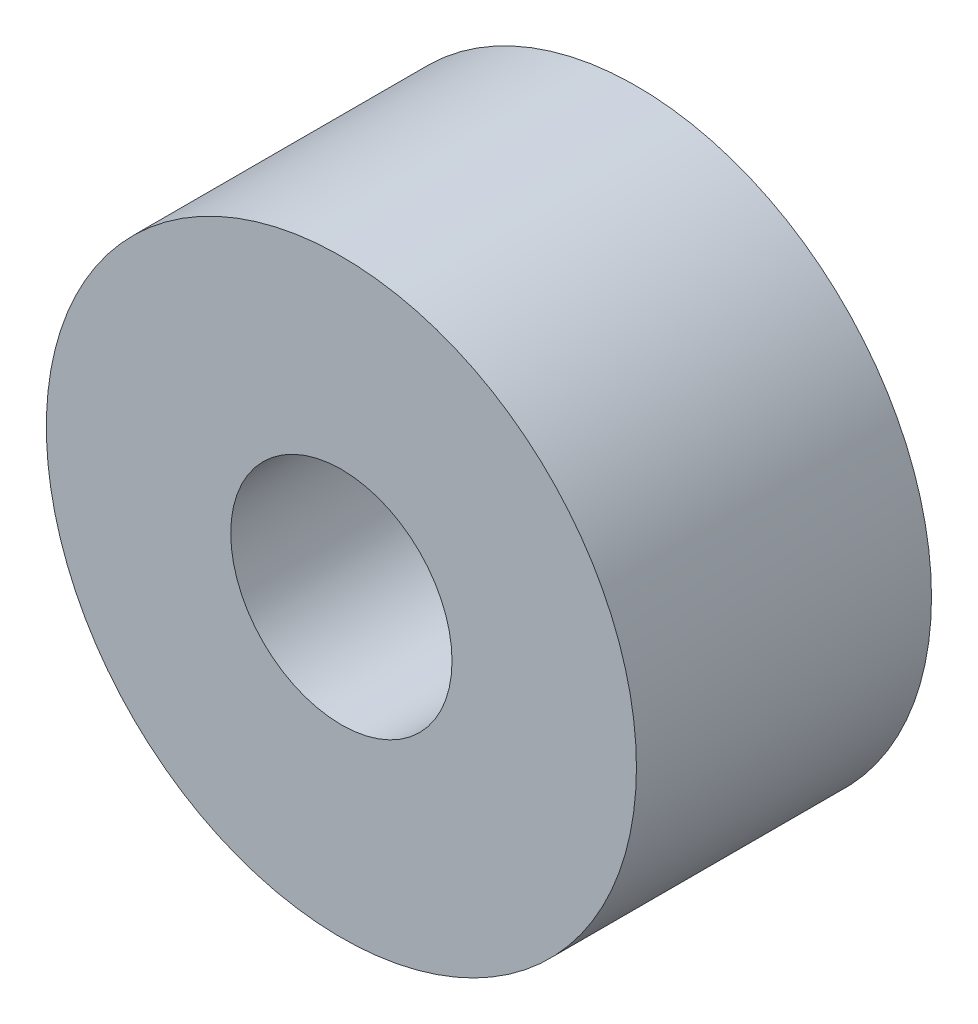
ISO-10303-21;
HEADER;
FILE_DESCRIPTION(('STEP AP214'),'2;1');
FILE_NAME('part.step','',(''),(''),'','','');
FILE_SCHEMA(('AUTOMOTIVE_DESIGN { 1 0 10303 214 1 1 1 1 }'));
ENDSEC;
DATA;
#1=APPLICATION_CONTEXT('core data for automotive mechanical design processes');
#2=APPLICATION_PROTOCOL_DEFINITION('international standard','automotive_design',2000,#1);
#3=PRODUCT_CONTEXT('',#1,'mechanical');
#4=PRODUCT('Part','Part','',(#3));
#5=PRODUCT_RELATED_PRODUCT_CATEGORY('part','',(#4));
#6=PRODUCT_DEFINITION_FORMATION('','',#4);
#7=PRODUCT_DEFINITION_CONTEXT('part definition',#1,'design');
#8=PRODUCT_DEFINITION('design','',#6,#7);
#9=PRODUCT_DEFINITION_SHAPE('','',#8);
#10=(LENGTH_UNIT() NAMED_UNIT(*) SI_UNIT(.MILLI.,.METRE.));
#11=(NAMED_UNIT(*) PLANE_ANGLE_UNIT() SI_UNIT($,.RADIAN.));
#12=(NAMED_UNIT(*) SI_UNIT($,.STERADIAN.) SOLID_ANGLE_UNIT());
#13=UNCERTAINTY_MEASURE_WITH_UNIT(LENGTH_MEASURE(1.E-05),#10,'distance_accuracy_value','');
#14=(GEOMETRIC_REPRESENTATION_CONTEXT(3) GLOBAL_UNCERTAINTY_ASSIGNED_CONTEXT((#13)) GLOBAL_UNIT_ASSIGNED_CONTEXT((#10,
#11,#12)) REPRESENTATION_CONTEXT('',''));
#15=CARTESIAN_POINT('',(0.,0.,0.));
#16=DIRECTION('',(0.,0.,1.));
#17=DIRECTION('',(1.,0.,0.));
#18=AXIS2_PLACEMENT_3D('',#15,#16,#17);
#19=CARTESIAN_POINT('',(0.,0.,3.175));
#20=DIRECTION('',(0.,0.,1.));
#21=DIRECTION('',(1.,0.,0.));
#22=AXIS2_PLACEMENT_3D('',#19,#20,#21);
#23=PLANE('',#22);
#24=CARTESIAN_POINT('',(0.,0.,3.175));
#25=DIRECTION('',(0.,0.,1.));
#26=DIRECTION('',(1.,0.,0.));
#27=AXIS2_PLACEMENT_3D('',#24,#25,#26);
#28=CIRCLE('',#27,6.35);
#29=CARTESIAN_POINT('',(6.35,0.,3.175));
#30=VERTEX_POINT('',#29);
#31=EDGE_CURVE('E10',#30,#30,#28,.T.);
#32=ORIENTED_EDGE('',*,*,#31,.T.);
#33=EDGE_LOOP('',(#32));
#34=FACE_BOUND('',#33,.T.);
#35=CARTESIAN_POINT('',(0.,0.,3.175));
#36=DIRECTION('',(0.,0.,1.));
#37=DIRECTION('',(1.,0.,0.));
#38=AXIS2_PLACEMENT_3D('',#35,#36,#37);
#39=CIRCLE('',#38,2.38125);
#40=CARTESIAN_POINT('',(2.38125,0.,3.175));
#41=VERTEX_POINT('',#40);
#42=EDGE_CURVE('E42',#41,#41,#39,.T.);
#43=ORIENTED_EDGE('',*,*,#42,.F.);
#44=EDGE_LOOP('',(#43));
#45=FACE_BOUND('',#44,.T.);
#46=ADVANCED_FACE('F31',(#34,#45),#23,.T.);
#47=CARTESIAN_POINT('',(0.,0.,-3.175));
#48=DIRECTION('',(0.,0.,1.));
#49=DIRECTION('',(1.,0.,0.));
#50=AXIS2_PLACEMENT_3D('',#47,#48,#49);
#51=PLANE('',#50);
#52=CARTESIAN_POINT('',(0.,0.,-3.175));
#53=DIRECTION('',(0.,0.,1.));
#54=DIRECTION('',(1.,0.,0.));
#55=AXIS2_PLACEMENT_3D('',#52,#53,#54);
#56=CIRCLE('',#55,6.35);
#57=CARTESIAN_POINT('',(6.35,0.,-3.175));
#58=VERTEX_POINT('',#57);
#59=EDGE_CURVE('E35',#58,#58,#56,.T.);
#60=ORIENTED_EDGE('',*,*,#59,.F.);
#61=EDGE_LOOP('',(#60));
#62=FACE_BOUND('',#61,.T.);
#63=CARTESIAN_POINT('',(0.,0.,-3.175));
#64=DIRECTION('',(0.,0.,1.));
#65=DIRECTION('',(1.,0.,0.));
#66=AXIS2_PLACEMENT_3D('',#63,#64,#65);
#67=CIRCLE('',#66,2.38125);
#68=CARTESIAN_POINT('',(2.38125,0.,-3.175));
#69=VERTEX_POINT('',#68);
#70=EDGE_CURVE('E44',#69,#69,#67,.T.);
#71=ORIENTED_EDGE('',*,*,#70,.T.);
#72=EDGE_LOOP('',(#71));
#73=FACE_BOUND('',#72,.T.);
#74=ADVANCED_FACE('F54',(#62,#73),#51,.F.);
#75=CARTESIAN_POINT('',(0.,0.,3.175));
#76=DIRECTION('',(0.,0.,-1.));
#77=DIRECTION('',(-1.,0.,0.));
#78=AXIS2_PLACEMENT_3D('',#75,#76,#77);
#79=CYLINDRICAL_SURFACE('',#78,6.35);
#80=ORIENTED_EDGE('',*,*,#31,.F.);
#81=EDGE_LOOP('',(#80));
#82=FACE_BOUND('',#81,.T.);
#83=ORIENTED_EDGE('',*,*,#59,.T.);
#84=EDGE_LOOP('',(#83));
#85=FACE_BOUND('',#84,.T.);
#86=ADVANCED_FACE('F33',(#82,#85),#79,.T.);
#87=CARTESIAN_POINT('',(0.,0.,3.175));
#88=DIRECTION('',(0.,0.,-1.));
#89=DIRECTION('',(-1.,0.,0.));
#90=AXIS2_PLACEMENT_3D('',#87,#88,#89);
#91=CYLINDRICAL_SURFACE('',#90,2.38125);
#92=ORIENTED_EDGE('',*,*,#42,.T.);
#93=EDGE_LOOP('',(#92));
#94=FACE_BOUND('',#93,.T.);
#95=ORIENTED_EDGE('',*,*,#70,.F.);
#96=EDGE_LOOP('',(#95));
#97=FACE_BOUND('',#96,.T.);
#98=ADVANCED_FACE('F50',(#94,#97),#91,.F.);
#99=CLOSED_SHELL('',(#46,#74,#86,#98));
#100=MANIFOLD_SOLID_BREP('B2',#99);
#101=ADVANCED_BREP_SHAPE_REPRESENTATION('',(#18,#100),#14);
#102=SHAPE_DEFINITION_REPRESENTATION(#9,#101);
ENDSEC;
END-ISO-10303-21;
